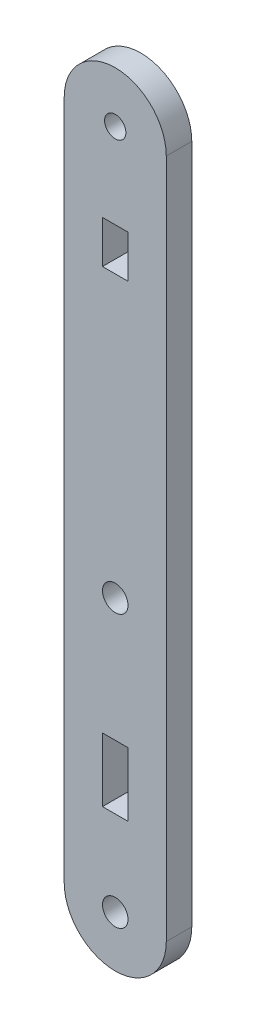
ISO-10303-21;
HEADER;
FILE_DESCRIPTION(('STEP AP214'),'2;1');
FILE_NAME('part.step','',(''),(''),'','','');
FILE_SCHEMA(('AUTOMOTIVE_DESIGN { 1 0 10303 214 1 1 1 1 }'));
ENDSEC;
DATA;
#1=APPLICATION_CONTEXT('core data for automotive mechanical design processes');
#2=APPLICATION_PROTOCOL_DEFINITION('international standard','automotive_design',2000,#1);
#3=PRODUCT_CONTEXT('',#1,'mechanical');
#4=PRODUCT('Part','Part','',(#3));
#5=PRODUCT_RELATED_PRODUCT_CATEGORY('part','',(#4));
#6=PRODUCT_DEFINITION_FORMATION('','',#4);
#7=PRODUCT_DEFINITION_CONTEXT('part definition',#1,'design');
#8=PRODUCT_DEFINITION('design','',#6,#7);
#9=PRODUCT_DEFINITION_SHAPE('','',#8);
#10=(LENGTH_UNIT() NAMED_UNIT(*) SI_UNIT(.MILLI.,.METRE.));
#11=(NAMED_UNIT(*) PLANE_ANGLE_UNIT() SI_UNIT($,.RADIAN.));
#12=(NAMED_UNIT(*) SI_UNIT($,.STERADIAN.) SOLID_ANGLE_UNIT());
#13=UNCERTAINTY_MEASURE_WITH_UNIT(LENGTH_MEASURE(1.E-05),#10,'distance_accuracy_value','');
#14=(GEOMETRIC_REPRESENTATION_CONTEXT(3) GLOBAL_UNCERTAINTY_ASSIGNED_CONTEXT((#13)) GLOBAL_UNIT_ASSIGNED_CONTEXT((#10,
#11,#12)) REPRESENTATION_CONTEXT('',''));
#15=CARTESIAN_POINT('',(0.,0.,0.));
#16=DIRECTION('',(0.,0.,1.));
#17=DIRECTION('',(1.,0.,0.));
#18=AXIS2_PLACEMENT_3D('',#15,#16,#17);
#19=CARTESIAN_POINT('',(18.300299998077,87.0000999980775,3.));
#20=DIRECTION('',(0.,0.,-1.));
#21=DIRECTION('',(-1.,0.,0.));
#22=AXIS2_PLACEMENT_3D('',#19,#20,#21);
#23=PLANE('',#22);
#24=CARTESIAN_POINT('',(18.3003,39.,3.));
#25=DIRECTION('',(0.,0.,1.));
#26=DIRECTION('',(1.,0.,0.));
#27=AXIS2_PLACEMENT_3D('',#24,#25,#26);
#28=CIRCLE('',#27,1.5);
#29=CARTESIAN_POINT('',(19.8003,39.,3.));
#30=VERTEX_POINT('',#29);
#31=EDGE_CURVE('E161',#30,#30,#28,.T.);
#32=ORIENTED_EDGE('',*,*,#31,.F.);
#33=EDGE_LOOP('',(#32));
#34=FACE_BOUND('',#33,.T.);
#35=DIRECTION('',(0.,-1.,0.));
#36=VECTOR('',#35,1.);
#37=CARTESIAN_POINT('',(16.8003,77.0001,3.));
#38=LINE('',#37,#36);
#39=CARTESIAN_POINT('',(16.8003,77.0001,3.));
#40=VERTEX_POINT('',#39);
#41=CARTESIAN_POINT('',(16.8003,72.0001,3.));
#42=VERTEX_POINT('',#41);
#43=EDGE_CURVE('E167',#40,#42,#38,.T.);
#44=ORIENTED_EDGE('',*,*,#43,.F.);
#45=DIRECTION('',(-1.,0.,0.));
#46=VECTOR('',#45,1.);
#47=CARTESIAN_POINT('',(16.8003,77.0001,3.));
#48=LINE('',#47,#46);
#49=CARTESIAN_POINT('',(19.8003,77.0001,3.));
#50=VERTEX_POINT('',#49);
#51=EDGE_CURVE('E175',#50,#40,#48,.T.);
#52=ORIENTED_EDGE('',*,*,#51,.F.);
#53=DIRECTION('',(0.,1.,0.));
#54=VECTOR('',#53,1.);
#55=CARTESIAN_POINT('',(19.8003,77.0001,3.));
#56=LINE('',#55,#54);
#57=CARTESIAN_POINT('',(19.8003,72.0001,3.));
#58=VERTEX_POINT('',#57);
#59=EDGE_CURVE('E172',#58,#50,#56,.T.);
#60=ORIENTED_EDGE('',*,*,#59,.F.);
#61=DIRECTION('',(1.,0.,0.));
#62=VECTOR('',#61,1.);
#63=CARTESIAN_POINT('',(16.8003,72.0001,3.));
#64=LINE('',#63,#62);
#65=EDGE_CURVE('E169',#42,#58,#64,.T.);
#66=ORIENTED_EDGE('',*,*,#65,.F.);
#67=EDGE_LOOP('',(#44,#52,#60,#66));
#68=FACE_BOUND('',#67,.T.);
#69=CARTESIAN_POINT('',(18.300299998077,87.0000999980775,3.));
#70=DIRECTION('',(0.,0.,1.));
#71=DIRECTION('',(-1.,0.,0.));
#72=AXIS2_PLACEMENT_3D('',#69,#70,#71);
#73=CIRCLE('',#72,6.00000000091974);
#74=CARTESIAN_POINT('',(24.3003000000001,87.0001,3.));
#75=VERTEX_POINT('',#74);
#76=CARTESIAN_POINT('',(12.3002999981606,87.0001,3.));
#77=VERTEX_POINT('',#76);
#78=EDGE_CURVE('E204',#75,#77,#73,.T.);
#79=ORIENTED_EDGE('',*,*,#78,.T.);
#80=DIRECTION('',(2.29955811336774E-11,-1.,0.));
#81=VECTOR('',#80,1.);
#82=CARTESIAN_POINT('',(12.3003000000002,7.00009999984356,3.));
#83=LINE('',#82,#81);
#84=CARTESIAN_POINT('',(12.3003000000002,7.00009999984356,3.));
#85=VERTEX_POINT('',#84);
#86=EDGE_CURVE('E207',#77,#85,#83,.T.);
#87=ORIENTED_EDGE('',*,*,#86,.T.);
#88=CARTESIAN_POINT('',(18.3003000008537,7.00015242343996,3.));
#89=DIRECTION('',(0.,0.,1.));
#90=DIRECTION('',(1.,0.,0.));
#91=AXIS2_PLACEMENT_3D('',#88,#89,#90);
#92=CIRCLE('',#91,6.00000000108252);
#93=CARTESIAN_POINT('',(24.3003000000002,7.00000000000302,3.));
#94=VERTEX_POINT('',#93);
#95=EDGE_CURVE('E210',#85,#94,#92,.T.);
#96=ORIENTED_EDGE('',*,*,#95,.T.);
#97=DIRECTION('',(0.,1.,0.));
#98=VECTOR('',#97,1.);
#99=CARTESIAN_POINT('',(24.3003000000001,87.0001,3.));
#100=LINE('',#99,#98);
#101=EDGE_CURVE('E212',#94,#75,#100,.T.);
#102=ORIENTED_EDGE('',*,*,#101,.T.);
#103=EDGE_LOOP('',(#79,#87,#96,#102));
#104=FACE_BOUND('',#103,.T.);
#105=CARTESIAN_POINT('',(18.300299998077,87.0000999980775,3.));
#106=DIRECTION('',(0.,0.,1.));
#107=DIRECTION('',(1.,0.,0.));
#108=AXIS2_PLACEMENT_3D('',#105,#106,#107);
#109=CIRCLE('',#108,1.25);
#110=CARTESIAN_POINT('',(19.550299998077,87.0000999980775,3.));
#111=VERTEX_POINT('',#110);
#112=EDGE_CURVE('E198',#111,#111,#109,.T.);
#113=ORIENTED_EDGE('',*,*,#112,.F.);
#114=EDGE_LOOP('',(#113));
#115=FACE_BOUND('',#114,.T.);
#116=DIRECTION('',(0.,1.,0.));
#117=VECTOR('',#116,1.);
#118=CARTESIAN_POINT('',(19.8003,17.0001000000006,3.));
#119=LINE('',#118,#117);
#120=CARTESIAN_POINT('',(19.8003,17.0001000000006,3.));
#121=VERTEX_POINT('',#120);
#122=CARTESIAN_POINT('',(19.8003,24.5001000000006,3.));
#123=VERTEX_POINT('',#122);
#124=EDGE_CURVE('E122',#121,#123,#119,.T.);
#125=ORIENTED_EDGE('',*,*,#124,.F.);
#126=DIRECTION('',(1.,0.,0.));
#127=VECTOR('',#126,1.);
#128=CARTESIAN_POINT('',(19.8003,17.0001000000006,3.));
#129=LINE('',#128,#127);
#130=CARTESIAN_POINT('',(16.8003,17.0001000000006,3.));
#131=VERTEX_POINT('',#130);
#132=EDGE_CURVE('E145',#131,#121,#129,.T.);
#133=ORIENTED_EDGE('',*,*,#132,.F.);
#134=DIRECTION('',(0.,-1.,0.));
#135=VECTOR('',#134,1.);
#136=CARTESIAN_POINT('',(16.8003,17.0001000000006,3.));
#137=LINE('',#136,#135);
#138=CARTESIAN_POINT('',(16.8003,24.5001000000006,3.));
#139=VERTEX_POINT('',#138);
#140=EDGE_CURVE('E143',#139,#131,#137,.T.);
#141=ORIENTED_EDGE('',*,*,#140,.F.);
#142=DIRECTION('',(-1.,0.,0.));
#143=VECTOR('',#142,1.);
#144=CARTESIAN_POINT('',(19.8003,24.5001000000006,3.));
#145=LINE('',#144,#143);
#146=EDGE_CURVE('E130',#123,#139,#145,.T.);
#147=ORIENTED_EDGE('',*,*,#146,.F.);
#148=EDGE_LOOP('',(#125,#133,#141,#147));
#149=FACE_BOUND('',#148,.T.);
#150=CARTESIAN_POINT('',(18.3034580515543,7.00708172682084,3.));
#151=DIRECTION('',(0.,0.,1.));
#152=DIRECTION('',(1.,0.,0.));
#153=AXIS2_PLACEMENT_3D('',#150,#151,#152);
#154=CIRCLE('',#153,1.5);
#155=CARTESIAN_POINT('',(19.8034580515543,7.00708172682084,3.));
#156=VERTEX_POINT('',#155);
#157=EDGE_CURVE('E151',#156,#156,#154,.T.);
#158=ORIENTED_EDGE('',*,*,#157,.F.);
#159=EDGE_LOOP('',(#158));
#160=FACE_BOUND('',#159,.T.);
#161=ADVANCED_FACE('F33',(#34,#68,#104,#115,#149,#160),#23,.F.);
#162=CARTESIAN_POINT('',(18.300299998077,87.0000999980775,0.));
#163=DIRECTION('',(0.,0.,-1.));
#164=DIRECTION('',(-1.,0.,0.));
#165=AXIS2_PLACEMENT_3D('',#162,#163,#164);
#166=PLANE('',#165);
#167=DIRECTION('',(1.,0.,0.));
#168=VECTOR('',#167,1.);
#169=CARTESIAN_POINT('',(19.8003,17.0001000000006,0.));
#170=LINE('',#169,#168);
#171=CARTESIAN_POINT('',(16.8003,17.0001000000006,0.));
#172=VERTEX_POINT('',#171);
#173=CARTESIAN_POINT('',(19.8003,17.0001000000006,0.));
#174=VERTEX_POINT('',#173);
#175=EDGE_CURVE('E131',#172,#174,#170,.T.);
#176=ORIENTED_EDGE('',*,*,#175,.T.);
#177=DIRECTION('',(0.,1.,0.));
#178=VECTOR('',#177,1.);
#179=CARTESIAN_POINT('',(19.8003,17.0001000000006,0.));
#180=LINE('',#179,#178);
#181=CARTESIAN_POINT('',(19.8003,24.5001000000006,0.));
#182=VERTEX_POINT('',#181);
#183=EDGE_CURVE('E56',#174,#182,#180,.T.);
#184=ORIENTED_EDGE('',*,*,#183,.T.);
#185=DIRECTION('',(-1.,0.,0.));
#186=VECTOR('',#185,1.);
#187=CARTESIAN_POINT('',(19.8003,24.5001000000006,0.));
#188=LINE('',#187,#186);
#189=CARTESIAN_POINT('',(16.8003,24.5001000000006,0.));
#190=VERTEX_POINT('',#189);
#191=EDGE_CURVE('E137',#182,#190,#188,.T.);
#192=ORIENTED_EDGE('',*,*,#191,.T.);
#193=DIRECTION('',(0.,-1.,0.));
#194=VECTOR('',#193,1.);
#195=CARTESIAN_POINT('',(16.8003,17.0001000000006,0.));
#196=LINE('',#195,#194);
#197=EDGE_CURVE('E153',#190,#172,#196,.T.);
#198=ORIENTED_EDGE('',*,*,#197,.T.);
#199=EDGE_LOOP('',(#176,#184,#192,#198));
#200=FACE_BOUND('',#199,.T.);
#201=CARTESIAN_POINT('',(18.3003,39.,0.));
#202=DIRECTION('',(0.,0.,1.));
#203=DIRECTION('',(1.,0.,0.));
#204=AXIS2_PLACEMENT_3D('',#201,#202,#203);
#205=CIRCLE('',#204,1.5);
#206=CARTESIAN_POINT('',(19.8003,39.,0.));
#207=VERTEX_POINT('',#206);
#208=EDGE_CURVE('E138',#207,#207,#205,.T.);
#209=ORIENTED_EDGE('',*,*,#208,.T.);
#210=EDGE_LOOP('',(#209));
#211=FACE_BOUND('',#210,.T.);
#212=CARTESIAN_POINT('',(18.300299998077,87.0000999980775,0.));
#213=DIRECTION('',(0.,0.,1.));
#214=DIRECTION('',(-1.,0.,0.));
#215=AXIS2_PLACEMENT_3D('',#212,#213,#214);
#216=CIRCLE('',#215,6.00000000091974);
#217=CARTESIAN_POINT('',(24.3003000000001,87.0001,0.));
#218=VERTEX_POINT('',#217);
#219=CARTESIAN_POINT('',(12.3002999981606,87.0001,0.));
#220=VERTEX_POINT('',#219);
#221=EDGE_CURVE('E201',#218,#220,#216,.T.);
#222=ORIENTED_EDGE('',*,*,#221,.F.);
#223=DIRECTION('',(0.,1.,0.));
#224=VECTOR('',#223,1.);
#225=CARTESIAN_POINT('',(24.3003000000001,87.0001,0.));
#226=LINE('',#225,#224);
#227=CARTESIAN_POINT('',(24.3003000000002,7.00000000000302,0.));
#228=VERTEX_POINT('',#227);
#229=EDGE_CURVE('E208',#228,#218,#226,.T.);
#230=ORIENTED_EDGE('',*,*,#229,.F.);
#231=CARTESIAN_POINT('',(18.3003000008537,7.00015242343996,0.));
#232=DIRECTION('',(0.,0.,1.));
#233=DIRECTION('',(1.,0.,0.));
#234=AXIS2_PLACEMENT_3D('',#231,#232,#233);
#235=CIRCLE('',#234,6.00000000108252);
#236=CARTESIAN_POINT('',(12.3003000000002,7.00009999984356,0.));
#237=VERTEX_POINT('',#236);
#238=EDGE_CURVE('E219',#237,#228,#235,.T.);
#239=ORIENTED_EDGE('',*,*,#238,.F.);
#240=DIRECTION('',(2.29955811336774E-11,-1.,0.));
#241=VECTOR('',#240,1.);
#242=CARTESIAN_POINT('',(12.3003000000002,7.00009999984356,0.));
#243=LINE('',#242,#241);
#244=EDGE_CURVE('E217',#220,#237,#243,.T.);
#245=ORIENTED_EDGE('',*,*,#244,.F.);
#246=EDGE_LOOP('',(#222,#230,#239,#245));
#247=FACE_BOUND('',#246,.T.);
#248=CARTESIAN_POINT('',(18.300299998077,87.0000999980775,0.));
#249=DIRECTION('',(0.,0.,1.));
#250=DIRECTION('',(1.,0.,0.));
#251=AXIS2_PLACEMENT_3D('',#248,#249,#250);
#252=CIRCLE('',#251,1.25);
#253=CARTESIAN_POINT('',(19.550299998077,87.0000999980775,0.));
#254=VERTEX_POINT('',#253);
#255=EDGE_CURVE('E197',#254,#254,#252,.T.);
#256=ORIENTED_EDGE('',*,*,#255,.T.);
#257=EDGE_LOOP('',(#256));
#258=FACE_BOUND('',#257,.T.);
#259=DIRECTION('',(-1.,0.,0.));
#260=VECTOR('',#259,1.);
#261=CARTESIAN_POINT('',(16.8003,77.0001,0.));
#262=LINE('',#261,#260);
#263=CARTESIAN_POINT('',(19.8003,77.0001,0.));
#264=VERTEX_POINT('',#263);
#265=CARTESIAN_POINT('',(16.8003,77.0001,0.));
#266=VERTEX_POINT('',#265);
#267=EDGE_CURVE('E170',#264,#266,#262,.T.);
#268=ORIENTED_EDGE('',*,*,#267,.T.);
#269=DIRECTION('',(0.,-1.,0.));
#270=VECTOR('',#269,1.);
#271=CARTESIAN_POINT('',(16.8003,77.0001,0.));
#272=LINE('',#271,#270);
#273=CARTESIAN_POINT('',(16.8003,72.0001,0.));
#274=VERTEX_POINT('',#273);
#275=EDGE_CURVE('E164',#266,#274,#272,.T.);
#276=ORIENTED_EDGE('',*,*,#275,.T.);
#277=DIRECTION('',(1.,0.,0.));
#278=VECTOR('',#277,1.);
#279=CARTESIAN_POINT('',(16.8003,72.0001,0.));
#280=LINE('',#279,#278);
#281=CARTESIAN_POINT('',(19.8003,72.0001,0.));
#282=VERTEX_POINT('',#281);
#283=EDGE_CURVE('E180',#274,#282,#280,.T.);
#284=ORIENTED_EDGE('',*,*,#283,.T.);
#285=DIRECTION('',(0.,1.,0.));
#286=VECTOR('',#285,1.);
#287=CARTESIAN_POINT('',(19.8003,77.0001,0.));
#288=LINE('',#287,#286);
#289=EDGE_CURVE('E183',#282,#264,#288,.T.);
#290=ORIENTED_EDGE('',*,*,#289,.T.);
#291=EDGE_LOOP('',(#268,#276,#284,#290));
#292=FACE_BOUND('',#291,.T.);
#293=CARTESIAN_POINT('',(18.3034580515543,7.00708172682084,0.));
#294=DIRECTION('',(0.,0.,1.));
#295=DIRECTION('',(1.,0.,0.));
#296=AXIS2_PLACEMENT_3D('',#293,#294,#295);
#297=CIRCLE('',#296,1.5);
#298=CARTESIAN_POINT('',(19.8034580515543,7.00708172682084,0.));
#299=VERTEX_POINT('',#298);
#300=EDGE_CURVE('E288',#299,#299,#297,.T.);
#301=ORIENTED_EDGE('',*,*,#300,.T.);
#302=EDGE_LOOP('',(#301));
#303=FACE_BOUND('',#302,.T.);
#304=ADVANCED_FACE('F237',(#200,#211,#247,#258,#292,#303),#166,.T.);
#305=CARTESIAN_POINT('',(18.300299998077,87.0000999980775,3.));
#306=DIRECTION('',(0.,0.,-1.));
#307=DIRECTION('',(-1.,0.,0.));
#308=AXIS2_PLACEMENT_3D('',#305,#306,#307);
#309=CYLINDRICAL_SURFACE('',#308,6.00000000091974);
#310=ORIENTED_EDGE('',*,*,#221,.T.);
#311=DIRECTION('',(0.,0.,-1.));
#312=VECTOR('',#311,1.);
#313=CARTESIAN_POINT('',(12.3002999981606,87.0001,3.));
#314=LINE('',#313,#312);
#315=EDGE_CURVE('E11',#77,#220,#314,.T.);
#316=ORIENTED_EDGE('',*,*,#315,.F.);
#317=ORIENTED_EDGE('',*,*,#78,.F.);
#318=DIRECTION('',(0.,0.,-1.));
#319=VECTOR('',#318,1.);
#320=CARTESIAN_POINT('',(24.3003000000001,87.0001,3.));
#321=LINE('',#320,#319);
#322=EDGE_CURVE('E214',#75,#218,#321,.T.);
#323=ORIENTED_EDGE('',*,*,#322,.T.);
#324=EDGE_LOOP('',(#310,#316,#317,#323));
#325=FACE_BOUND('',#324,.T.);
#326=ADVANCED_FACE('F35',(#325),#309,.T.);
#327=CARTESIAN_POINT('',(12.3003000000002,7.00009999984356,3.));
#328=DIRECTION('',(1.,2.29955811336774E-11,0.));
#329=DIRECTION('',(-2.29955811336774E-11,1.,0.));
#330=AXIS2_PLACEMENT_3D('',#327,#328,#329);
#331=PLANE('',#330);
#332=ORIENTED_EDGE('',*,*,#244,.T.);
#333=DIRECTION('',(0.,0.,-1.));
#334=VECTOR('',#333,1.);
#335=CARTESIAN_POINT('',(12.3003000000002,7.00009999984356,3.));
#336=LINE('',#335,#334);
#337=EDGE_CURVE('E41',#85,#237,#336,.T.);
#338=ORIENTED_EDGE('',*,*,#337,.F.);
#339=ORIENTED_EDGE('',*,*,#86,.F.);
#340=ORIENTED_EDGE('',*,*,#315,.T.);
#341=EDGE_LOOP('',(#332,#338,#339,#340));
#342=FACE_BOUND('',#341,.T.);
#343=ADVANCED_FACE('F248',(#342),#331,.F.);
#344=CARTESIAN_POINT('',(18.3003000008537,7.00015242343996,3.));
#345=DIRECTION('',(0.,0.,-1.));
#346=DIRECTION('',(-1.,0.,0.));
#347=AXIS2_PLACEMENT_3D('',#344,#345,#346);
#348=CYLINDRICAL_SURFACE('',#347,6.00000000108252);
#349=ORIENTED_EDGE('',*,*,#238,.T.);
#350=DIRECTION('',(0.,0.,-1.));
#351=VECTOR('',#350,1.);
#352=CARTESIAN_POINT('',(24.3003000000002,7.00000000000302,3.));
#353=LINE('',#352,#351);
#354=EDGE_CURVE('E224',#94,#228,#353,.T.);
#355=ORIENTED_EDGE('',*,*,#354,.F.);
#356=ORIENTED_EDGE('',*,*,#95,.F.);
#357=ORIENTED_EDGE('',*,*,#337,.T.);
#358=EDGE_LOOP('',(#349,#355,#356,#357));
#359=FACE_BOUND('',#358,.T.);
#360=ADVANCED_FACE('F231',(#359),#348,.T.);
#361=CARTESIAN_POINT('',(24.3003000000001,87.0001,3.));
#362=DIRECTION('',(-1.,0.,0.));
#363=DIRECTION('',(0.,-1.,0.));
#364=AXIS2_PLACEMENT_3D('',#361,#362,#363);
#365=PLANE('',#364);
#366=ORIENTED_EDGE('',*,*,#229,.T.);
#367=ORIENTED_EDGE('',*,*,#322,.F.);
#368=ORIENTED_EDGE('',*,*,#101,.F.);
#369=ORIENTED_EDGE('',*,*,#354,.T.);
#370=EDGE_LOOP('',(#366,#367,#368,#369));
#371=FACE_BOUND('',#370,.T.);
#372=ADVANCED_FACE('F241',(#371),#365,.F.);
#373=CARTESIAN_POINT('',(18.300299998077,87.0000999980775,3.));
#374=DIRECTION('',(0.,0.,-1.));
#375=DIRECTION('',(-1.,0.,0.));
#376=AXIS2_PLACEMENT_3D('',#373,#374,#375);
#377=CYLINDRICAL_SURFACE('',#376,1.25);
#378=ORIENTED_EDGE('',*,*,#112,.T.);
#379=EDGE_LOOP('',(#378));
#380=FACE_BOUND('',#379,.T.);
#381=ORIENTED_EDGE('',*,*,#255,.F.);
#382=EDGE_LOOP('',(#381));
#383=FACE_BOUND('',#382,.T.);
#384=ADVANCED_FACE('F266',(#380,#383),#377,.F.);
#385=CARTESIAN_POINT('',(16.8003,77.0001,3.));
#386=DIRECTION('',(1.,0.,0.));
#387=DIRECTION('',(0.,0.,-1.));
#388=AXIS2_PLACEMENT_3D('',#385,#386,#387);
#389=PLANE('',#388);
#390=ORIENTED_EDGE('',*,*,#275,.F.);
#391=DIRECTION('',(0.,0.,-1.));
#392=VECTOR('',#391,1.);
#393=CARTESIAN_POINT('',(16.8003,77.0001,3.));
#394=LINE('',#393,#392);
#395=EDGE_CURVE('E177',#40,#266,#394,.T.);
#396=ORIENTED_EDGE('',*,*,#395,.F.);
#397=ORIENTED_EDGE('',*,*,#43,.T.);
#398=DIRECTION('',(0.,0.,-1.));
#399=VECTOR('',#398,1.);
#400=CARTESIAN_POINT('',(16.8003,72.0001,3.));
#401=LINE('',#400,#399);
#402=EDGE_CURVE('E194',#42,#274,#401,.T.);
#403=ORIENTED_EDGE('',*,*,#402,.T.);
#404=EDGE_LOOP('',(#390,#396,#397,#403));
#405=FACE_BOUND('',#404,.T.);
#406=ADVANCED_FACE('F273',(#405),#389,.T.);
#407=CARTESIAN_POINT('',(16.8003,72.0001,3.));
#408=DIRECTION('',(0.,1.,0.));
#409=DIRECTION('',(0.,0.,1.));
#410=AXIS2_PLACEMENT_3D('',#407,#408,#409);
#411=PLANE('',#410);
#412=ORIENTED_EDGE('',*,*,#283,.F.);
#413=ORIENTED_EDGE('',*,*,#402,.F.);
#414=ORIENTED_EDGE('',*,*,#65,.T.);
#415=DIRECTION('',(0.,0.,-1.));
#416=VECTOR('',#415,1.);
#417=CARTESIAN_POINT('',(19.8003,72.0001,3.));
#418=LINE('',#417,#416);
#419=EDGE_CURVE('E192',#58,#282,#418,.T.);
#420=ORIENTED_EDGE('',*,*,#419,.T.);
#421=EDGE_LOOP('',(#412,#413,#414,#420));
#422=FACE_BOUND('',#421,.T.);
#423=ADVANCED_FACE('F278',(#422),#411,.T.);
#424=CARTESIAN_POINT('',(19.8003,77.0001,3.));
#425=DIRECTION('',(-1.,0.,0.));
#426=DIRECTION('',(0.,0.,1.));
#427=AXIS2_PLACEMENT_3D('',#424,#425,#426);
#428=PLANE('',#427);
#429=ORIENTED_EDGE('',*,*,#289,.F.);
#430=ORIENTED_EDGE('',*,*,#419,.F.);
#431=ORIENTED_EDGE('',*,*,#59,.T.);
#432=DIRECTION('',(0.,0.,-1.));
#433=VECTOR('',#432,1.);
#434=CARTESIAN_POINT('',(19.8003,77.0001,3.));
#435=LINE('',#434,#433);
#436=EDGE_CURVE('E190',#50,#264,#435,.T.);
#437=ORIENTED_EDGE('',*,*,#436,.T.);
#438=EDGE_LOOP('',(#429,#430,#431,#437));
#439=FACE_BOUND('',#438,.T.);
#440=ADVANCED_FACE('F318',(#439),#428,.T.);
#441=CARTESIAN_POINT('',(16.8003,77.0001,3.));
#442=DIRECTION('',(0.,-1.,0.));
#443=DIRECTION('',(0.,0.,-1.));
#444=AXIS2_PLACEMENT_3D('',#441,#442,#443);
#445=PLANE('',#444);
#446=ORIENTED_EDGE('',*,*,#267,.F.);
#447=ORIENTED_EDGE('',*,*,#436,.F.);
#448=ORIENTED_EDGE('',*,*,#51,.T.);
#449=ORIENTED_EDGE('',*,*,#395,.T.);
#450=EDGE_LOOP('',(#446,#447,#448,#449));
#451=FACE_BOUND('',#450,.T.);
#452=ADVANCED_FACE('F314',(#451),#445,.T.);
#453=CARTESIAN_POINT('',(18.3003,39.,3.));
#454=DIRECTION('',(0.,0.,-1.));
#455=DIRECTION('',(-1.,0.,0.));
#456=AXIS2_PLACEMENT_3D('',#453,#454,#455);
#457=CYLINDRICAL_SURFACE('',#456,1.5);
#458=ORIENTED_EDGE('',*,*,#31,.T.);
#459=EDGE_LOOP('',(#458));
#460=FACE_BOUND('',#459,.T.);
#461=ORIENTED_EDGE('',*,*,#208,.F.);
#462=EDGE_LOOP('',(#461));
#463=FACE_BOUND('',#462,.T.);
#464=ADVANCED_FACE('F311',(#460,#463),#457,.F.);
#465=CARTESIAN_POINT('',(19.8003,17.0001000000006,3.));
#466=DIRECTION('',(-1.,0.,0.));
#467=DIRECTION('',(0.,0.,1.));
#468=AXIS2_PLACEMENT_3D('',#465,#466,#467);
#469=PLANE('',#468);
#470=ORIENTED_EDGE('',*,*,#183,.F.);
#471=DIRECTION('',(0.,0.,-1.));
#472=VECTOR('',#471,1.);
#473=CARTESIAN_POINT('',(19.8003,17.0001000000006,3.));
#474=LINE('',#473,#472);
#475=EDGE_CURVE('E126',#121,#174,#474,.T.);
#476=ORIENTED_EDGE('',*,*,#475,.F.);
#477=ORIENTED_EDGE('',*,*,#124,.T.);
#478=DIRECTION('',(0.,0.,-1.));
#479=VECTOR('',#478,1.);
#480=CARTESIAN_POINT('',(19.8003,24.5001000000006,3.));
#481=LINE('',#480,#479);
#482=EDGE_CURVE('E125',#123,#182,#481,.T.);
#483=ORIENTED_EDGE('',*,*,#482,.T.);
#484=EDGE_LOOP('',(#470,#476,#477,#483));
#485=FACE_BOUND('',#484,.T.);
#486=ADVANCED_FACE('F124',(#485),#469,.T.);
#487=CARTESIAN_POINT('',(19.8003,24.5001000000006,3.));
#488=DIRECTION('',(0.,-1.,0.));
#489=DIRECTION('',(0.,0.,-1.));
#490=AXIS2_PLACEMENT_3D('',#487,#488,#489);
#491=PLANE('',#490);
#492=ORIENTED_EDGE('',*,*,#191,.F.);
#493=ORIENTED_EDGE('',*,*,#482,.F.);
#494=ORIENTED_EDGE('',*,*,#146,.T.);
#495=DIRECTION('',(0.,0.,-1.));
#496=VECTOR('',#495,1.);
#497=CARTESIAN_POINT('',(16.8003,24.5001000000006,3.));
#498=LINE('',#497,#496);
#499=EDGE_CURVE('E139',#139,#190,#498,.T.);
#500=ORIENTED_EDGE('',*,*,#499,.T.);
#501=EDGE_LOOP('',(#492,#493,#494,#500));
#502=FACE_BOUND('',#501,.T.);
#503=ADVANCED_FACE('F134',(#502),#491,.T.);
#504=CARTESIAN_POINT('',(16.8003,17.0001000000006,3.));
#505=DIRECTION('',(1.,0.,0.));
#506=DIRECTION('',(0.,0.,-1.));
#507=AXIS2_PLACEMENT_3D('',#504,#505,#506);
#508=PLANE('',#507);
#509=ORIENTED_EDGE('',*,*,#197,.F.);
#510=ORIENTED_EDGE('',*,*,#499,.F.);
#511=ORIENTED_EDGE('',*,*,#140,.T.);
#512=DIRECTION('',(0.,0.,-1.));
#513=VECTOR('',#512,1.);
#514=CARTESIAN_POINT('',(16.8003,17.0001000000006,3.));
#515=LINE('',#514,#513);
#516=EDGE_CURVE('E48',#131,#172,#515,.T.);
#517=ORIENTED_EDGE('',*,*,#516,.T.);
#518=EDGE_LOOP('',(#509,#510,#511,#517));
#519=FACE_BOUND('',#518,.T.);
#520=ADVANCED_FACE('F301',(#519),#508,.T.);
#521=CARTESIAN_POINT('',(19.8003,17.0001000000006,3.));
#522=DIRECTION('',(0.,1.,0.));
#523=DIRECTION('',(0.,0.,1.));
#524=AXIS2_PLACEMENT_3D('',#521,#522,#523);
#525=PLANE('',#524);
#526=ORIENTED_EDGE('',*,*,#175,.F.);
#527=ORIENTED_EDGE('',*,*,#516,.F.);
#528=ORIENTED_EDGE('',*,*,#132,.T.);
#529=ORIENTED_EDGE('',*,*,#475,.T.);
#530=EDGE_LOOP('',(#526,#527,#528,#529));
#531=FACE_BOUND('',#530,.T.);
#532=ADVANCED_FACE('F296',(#531),#525,.T.);
#533=CARTESIAN_POINT('',(18.3034580515543,7.00708172682084,3.));
#534=DIRECTION('',(0.,0.,-1.));
#535=DIRECTION('',(-1.,0.,0.));
#536=AXIS2_PLACEMENT_3D('',#533,#534,#535);
#537=CYLINDRICAL_SURFACE('',#536,1.5);
#538=ORIENTED_EDGE('',*,*,#157,.T.);
#539=EDGE_LOOP('',(#538));
#540=FACE_BOUND('',#539,.T.);
#541=ORIENTED_EDGE('',*,*,#300,.F.);
#542=EDGE_LOOP('',(#541));
#543=FACE_BOUND('',#542,.T.);
#544=ADVANCED_FACE('F294',(#540,#543),#537,.F.);
#545=CLOSED_SHELL('',(#161,#304,#326,#343,#360,#372,#384,#406,#423,#440,#452,#464,#486,#503,
#520,#532,#544));
#546=MANIFOLD_SOLID_BREP('B2',#545);
#547=ADVANCED_BREP_SHAPE_REPRESENTATION('',(#18,#546),#14);
#548=SHAPE_DEFINITION_REPRESENTATION(#9,#547);
ENDSEC;
END-ISO-10303-21;
